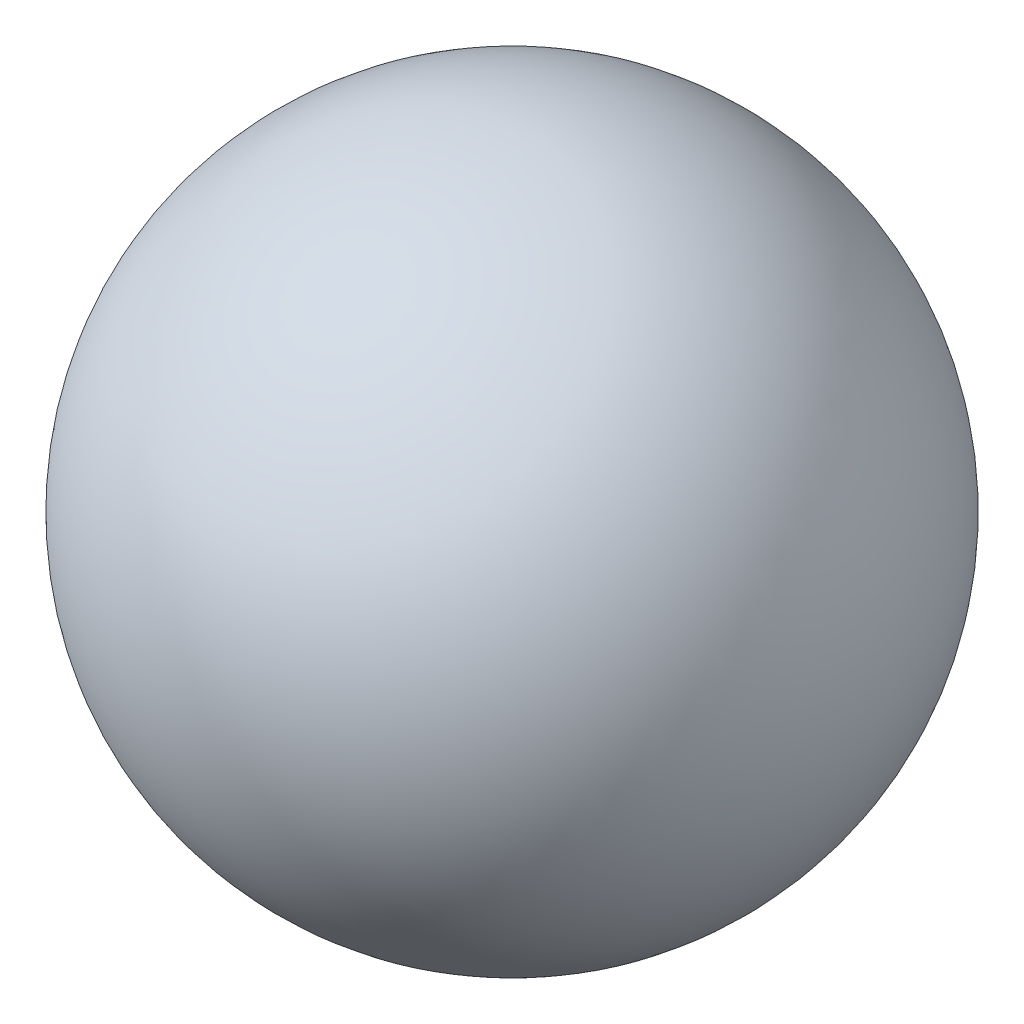
ISO-10303-21;
HEADER;
FILE_DESCRIPTION(('STEP AP214'),'2;1');
FILE_NAME('part.step','',(''),(''),'','','');
FILE_SCHEMA(('AUTOMOTIVE_DESIGN { 1 0 10303 214 1 1 1 1 }'));
ENDSEC;
DATA;
#1=APPLICATION_CONTEXT('core data for automotive mechanical design processes');
#2=APPLICATION_PROTOCOL_DEFINITION('international standard','automotive_design',2000,#1);
#3=PRODUCT_CONTEXT('',#1,'mechanical');
#4=PRODUCT('Part','Part','',(#3));
#5=PRODUCT_RELATED_PRODUCT_CATEGORY('part','',(#4));
#6=PRODUCT_DEFINITION_FORMATION('','',#4);
#7=PRODUCT_DEFINITION_CONTEXT('part definition',#1,'design');
#8=PRODUCT_DEFINITION('design','',#6,#7);
#9=PRODUCT_DEFINITION_SHAPE('','',#8);
#10=(LENGTH_UNIT() NAMED_UNIT(*) SI_UNIT(.MILLI.,.METRE.));
#11=(NAMED_UNIT(*) PLANE_ANGLE_UNIT() SI_UNIT($,.RADIAN.));
#12=(NAMED_UNIT(*) SI_UNIT($,.STERADIAN.) SOLID_ANGLE_UNIT());
#13=UNCERTAINTY_MEASURE_WITH_UNIT(LENGTH_MEASURE(1.E-05),#10,'distance_accuracy_value','');
#14=(GEOMETRIC_REPRESENTATION_CONTEXT(3) GLOBAL_UNCERTAINTY_ASSIGNED_CONTEXT((#13)) GLOBAL_UNIT_ASSIGNED_CONTEXT((#10,
#11,#12)) REPRESENTATION_CONTEXT('',''));
#15=CARTESIAN_POINT('',(0.,0.,0.));
#16=DIRECTION('',(0.,0.,1.));
#17=DIRECTION('',(1.,0.,0.));
#18=AXIS2_PLACEMENT_3D('',#15,#16,#17);
#19=CARTESIAN_POINT('',(0.,0.,0.));
#20=DIRECTION('',(0.,1.,0.));
#21=DIRECTION('',(1.,0.,0.));
#22=AXIS2_PLACEMENT_3D('',#19,#20,#21);
#23=SPHERICAL_SURFACE('',#22,6.35);
#24=CARTESIAN_POINT('',(0.,6.35,0.));
#25=VERTEX_POINT('',#24);
#26=VERTEX_LOOP('',#25);
#27=FACE_BOUND('',#26,.T.);
#28=ADVANCED_FACE('F38',(#27),#23,.T.);
#29=CLOSED_SHELL('',(#28));
#30=MANIFOLD_SOLID_BREP('B2',#29);
#31=ADVANCED_BREP_SHAPE_REPRESENTATION('',(#18,#30),#14);
#32=SHAPE_DEFINITION_REPRESENTATION(#9,#31);
ENDSEC;
END-ISO-10303-21;
